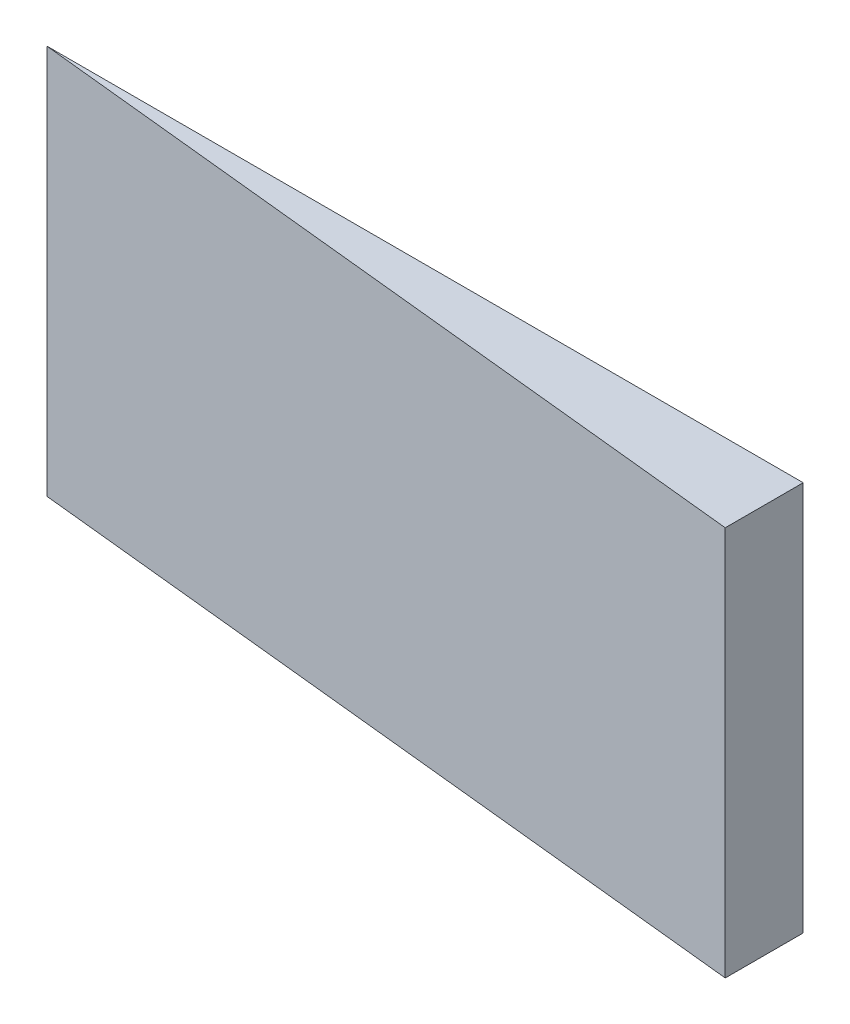
ISO-10303-21;
HEADER;
FILE_DESCRIPTION(('STEP AP214'),'2;1');
FILE_NAME('part.step','',(''),(''),'','','');
FILE_SCHEMA(('AUTOMOTIVE_DESIGN { 1 0 10303 214 1 1 1 1 }'));
ENDSEC;
DATA;
#1=APPLICATION_CONTEXT('core data for automotive mechanical design processes');
#2=APPLICATION_PROTOCOL_DEFINITION('international standard','automotive_design',2000,#1);
#3=PRODUCT_CONTEXT('',#1,'mechanical');
#4=PRODUCT('Part','Part','',(#3));
#5=PRODUCT_RELATED_PRODUCT_CATEGORY('part','',(#4));
#6=PRODUCT_DEFINITION_FORMATION('','',#4);
#7=PRODUCT_DEFINITION_CONTEXT('part definition',#1,'design');
#8=PRODUCT_DEFINITION('design','',#6,#7);
#9=PRODUCT_DEFINITION_SHAPE('','',#8);
#10=(LENGTH_UNIT() NAMED_UNIT(*) SI_UNIT(.MILLI.,.METRE.));
#11=(NAMED_UNIT(*) PLANE_ANGLE_UNIT() SI_UNIT($,.RADIAN.));
#12=(NAMED_UNIT(*) SI_UNIT($,.STERADIAN.) SOLID_ANGLE_UNIT());
#13=UNCERTAINTY_MEASURE_WITH_UNIT(LENGTH_MEASURE(1.E-05),#10,'distance_accuracy_value','');
#14=(GEOMETRIC_REPRESENTATION_CONTEXT(3) GLOBAL_UNCERTAINTY_ASSIGNED_CONTEXT((#13)) GLOBAL_UNIT_ASSIGNED_CONTEXT((#10,
#11,#12)) REPRESENTATION_CONTEXT('',''));
#15=CARTESIAN_POINT('',(0.,0.,0.));
#16=DIRECTION('',(0.,0.,1.));
#17=DIRECTION('',(1.,0.,0.));
#18=AXIS2_PLACEMENT_3D('',#15,#16,#17);
#19=CARTESIAN_POINT('',(-48.5000000000001,25.,0.));
#20=DIRECTION('',(0.,0.,1.));
#21=DIRECTION('',(1.,0.,0.));
#22=AXIS2_PLACEMENT_3D('',#19,#20,#21);
#23=PLANE('',#22);
#24=DIRECTION('',(-1.,0.,0.));
#25=VECTOR('',#24,1.);
#26=CARTESIAN_POINT('',(-48.5000000000001,0.,0.));
#27=LINE('',#26,#25);
#28=CARTESIAN_POINT('',(0.,0.,0.));
#29=VERTEX_POINT('',#28);
#30=CARTESIAN_POINT('',(-48.5000000000001,0.,0.));
#31=VERTEX_POINT('',#30);
#32=EDGE_CURVE('E81',#29,#31,#27,.T.);
#33=ORIENTED_EDGE('',*,*,#32,.T.);
#34=DIRECTION('',(0.,-1.,0.));
#35=VECTOR('',#34,1.);
#36=CARTESIAN_POINT('',(-48.5000000000001,25.,0.));
#37=LINE('',#36,#35);
#38=CARTESIAN_POINT('',(-48.5000000000001,25.,0.));
#39=VERTEX_POINT('',#38);
#40=EDGE_CURVE('E11',#39,#31,#37,.T.);
#41=ORIENTED_EDGE('',*,*,#40,.F.);
#42=DIRECTION('',(-1.,0.,0.));
#43=VECTOR('',#42,1.);
#44=CARTESIAN_POINT('',(-48.5000000000001,25.,0.));
#45=LINE('',#44,#43);
#46=CARTESIAN_POINT('',(0.,25.,0.));
#47=VERTEX_POINT('',#46);
#48=EDGE_CURVE('E74',#47,#39,#45,.T.);
#49=ORIENTED_EDGE('',*,*,#48,.F.);
#50=DIRECTION('',(0.,-1.,0.));
#51=VECTOR('',#50,1.);
#52=CARTESIAN_POINT('',(0.,25.,0.));
#53=LINE('',#52,#51);
#54=EDGE_CURVE('E82',#47,#29,#53,.T.);
#55=ORIENTED_EDGE('',*,*,#54,.T.);
#56=EDGE_LOOP('',(#33,#41,#49,#55));
#57=FACE_BOUND('',#56,.T.);
#58=ADVANCED_FACE('F34',(#57),#23,.F.);
#59=CARTESIAN_POINT('',(-48.5000000000001,25.,0.));
#60=DIRECTION('',(0.102549270737555,0.,-0.994727926154281));
#61=DIRECTION('',(-0.994727926154281,0.,-0.102549270737555));
#62=AXIS2_PLACEMENT_3D('',#59,#60,#61);
#63=PLANE('',#62);
#64=DIRECTION('',(0.994727926154281,0.,0.102549270737555));
#65=VECTOR('',#64,1.);
#66=CARTESIAN_POINT('',(-48.5000000000001,0.,0.));
#67=LINE('',#66,#65);
#68=CARTESIAN_POINT('',(0.,0.,5.));
#69=VERTEX_POINT('',#68);
#70=EDGE_CURVE('E62',#31,#69,#67,.T.);
#71=ORIENTED_EDGE('',*,*,#70,.T.);
#72=DIRECTION('',(0.,-1.,0.));
#73=VECTOR('',#72,1.);
#74=CARTESIAN_POINT('',(0.,25.,5.));
#75=LINE('',#74,#73);
#76=CARTESIAN_POINT('',(0.,25.,5.));
#77=VERTEX_POINT('',#76);
#78=EDGE_CURVE('E42',#77,#69,#75,.T.);
#79=ORIENTED_EDGE('',*,*,#78,.F.);
#80=DIRECTION('',(0.994727926154281,0.,0.102549270737555));
#81=VECTOR('',#80,1.);
#82=CARTESIAN_POINT('',(-48.5000000000001,25.,0.));
#83=LINE('',#82,#81);
#84=EDGE_CURVE('E70',#39,#77,#83,.T.);
#85=ORIENTED_EDGE('',*,*,#84,.F.);
#86=ORIENTED_EDGE('',*,*,#40,.T.);
#87=EDGE_LOOP('',(#71,#79,#85,#86));
#88=FACE_BOUND('',#87,.T.);
#89=ADVANCED_FACE('F71',(#88),#63,.F.);
#90=CARTESIAN_POINT('',(0.,25.,0.));
#91=DIRECTION('',(-1.,0.,0.));
#92=DIRECTION('',(0.,0.,1.));
#93=AXIS2_PLACEMENT_3D('',#90,#91,#92);
#94=PLANE('',#93);
#95=DIRECTION('',(0.,0.,-1.));
#96=VECTOR('',#95,1.);
#97=CARTESIAN_POINT('',(0.,0.,0.));
#98=LINE('',#97,#96);
#99=EDGE_CURVE('E67',#69,#29,#98,.T.);
#100=ORIENTED_EDGE('',*,*,#99,.T.);
#101=ORIENTED_EDGE('',*,*,#54,.F.);
#102=DIRECTION('',(0.,0.,-1.));
#103=VECTOR('',#102,1.);
#104=CARTESIAN_POINT('',(0.,25.,0.));
#105=LINE('',#104,#103);
#106=EDGE_CURVE('E50',#77,#47,#105,.T.);
#107=ORIENTED_EDGE('',*,*,#106,.F.);
#108=ORIENTED_EDGE('',*,*,#78,.T.);
#109=EDGE_LOOP('',(#100,#101,#107,#108));
#110=FACE_BOUND('',#109,.T.);
#111=ADVANCED_FACE('F89',(#110),#94,.F.);
#112=CARTESIAN_POINT('',(0.,25.,0.));
#113=DIRECTION('',(0.,-1.,0.));
#114=DIRECTION('',(0.,0.,-1.));
#115=AXIS2_PLACEMENT_3D('',#112,#113,#114);
#116=PLANE('',#115);
#117=ORIENTED_EDGE('',*,*,#48,.T.);
#118=ORIENTED_EDGE('',*,*,#84,.T.);
#119=ORIENTED_EDGE('',*,*,#106,.T.);
#120=EDGE_LOOP('',(#117,#118,#119));
#121=FACE_BOUND('',#120,.T.);
#122=ADVANCED_FACE('F77',(#121),#116,.F.);
#123=CARTESIAN_POINT('',(0.,0.,0.));
#124=DIRECTION('',(0.,-1.,0.));
#125=DIRECTION('',(0.,0.,-1.));
#126=AXIS2_PLACEMENT_3D('',#123,#124,#125);
#127=PLANE('',#126);
#128=ORIENTED_EDGE('',*,*,#32,.F.);
#129=ORIENTED_EDGE('',*,*,#99,.F.);
#130=ORIENTED_EDGE('',*,*,#70,.F.);
#131=EDGE_LOOP('',(#128,#129,#130));
#132=FACE_BOUND('',#131,.T.);
#133=ADVANCED_FACE('F90',(#132),#127,.T.);
#134=CLOSED_SHELL('',(#58,#89,#111,#122,#133));
#135=MANIFOLD_SOLID_BREP('B2',#134);
#136=ADVANCED_BREP_SHAPE_REPRESENTATION('',(#18,#135),#14);
#137=SHAPE_DEFINITION_REPRESENTATION(#9,#136);
ENDSEC;
END-ISO-10303-21;
